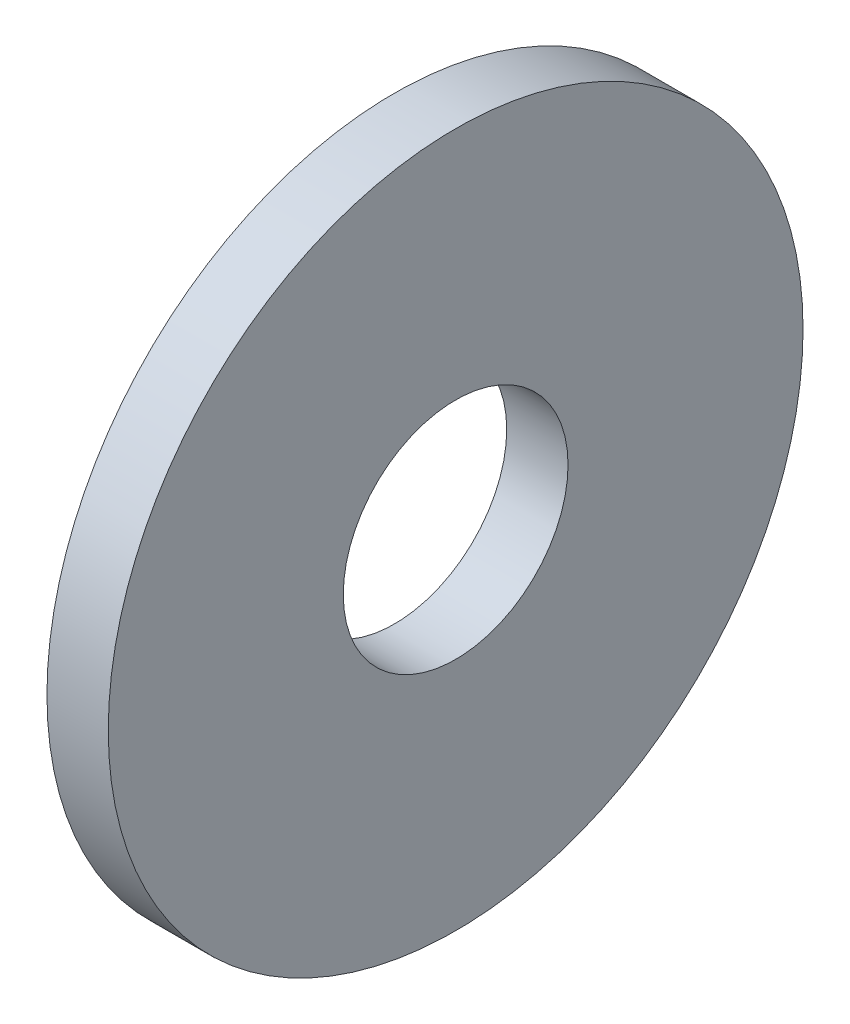
ISO-10303-21;
HEADER;
FILE_DESCRIPTION(('STEP AP214'),'2;1');
FILE_NAME('part.step','',(''),(''),'','','');
FILE_SCHEMA(('AUTOMOTIVE_DESIGN { 1 0 10303 214 1 1 1 1 }'));
ENDSEC;
DATA;
#1=APPLICATION_CONTEXT('core data for automotive mechanical design processes');
#2=APPLICATION_PROTOCOL_DEFINITION('international standard','automotive_design',2000,#1);
#3=PRODUCT_CONTEXT('',#1,'mechanical');
#4=PRODUCT('Part','Part','',(#3));
#5=PRODUCT_RELATED_PRODUCT_CATEGORY('part','',(#4));
#6=PRODUCT_DEFINITION_FORMATION('','',#4);
#7=PRODUCT_DEFINITION_CONTEXT('part definition',#1,'design');
#8=PRODUCT_DEFINITION('design','',#6,#7);
#9=PRODUCT_DEFINITION_SHAPE('','',#8);
#10=(LENGTH_UNIT() NAMED_UNIT(*) SI_UNIT(.MILLI.,.METRE.));
#11=(NAMED_UNIT(*) PLANE_ANGLE_UNIT() SI_UNIT($,.RADIAN.));
#12=(NAMED_UNIT(*) SI_UNIT($,.STERADIAN.) SOLID_ANGLE_UNIT());
#13=UNCERTAINTY_MEASURE_WITH_UNIT(LENGTH_MEASURE(1.E-05),#10,'distance_accuracy_value','');
#14=(GEOMETRIC_REPRESENTATION_CONTEXT(3) GLOBAL_UNCERTAINTY_ASSIGNED_CONTEXT((#13)) GLOBAL_UNIT_ASSIGNED_CONTEXT((#10,
#11,#12)) REPRESENTATION_CONTEXT('',''));
#15=CARTESIAN_POINT('',(0.,0.,0.));
#16=DIRECTION('',(0.,0.,1.));
#17=DIRECTION('',(1.,0.,0.));
#18=AXIS2_PLACEMENT_3D('',#15,#16,#17);
#19=CARTESIAN_POINT('',(-34.9249999999999,0.,0.));
#20=DIRECTION('',(-1.,0.,0.));
#21=DIRECTION('',(0.,0.,1.));
#22=AXIS2_PLACEMENT_3D('',#19,#20,#21);
#23=CYLINDRICAL_SURFACE('',#22,5.5);
#24=CARTESIAN_POINT('',(0.,0.,0.));
#25=DIRECTION('',(-1.,0.,0.));
#26=DIRECTION('',(0.,0.,1.));
#27=AXIS2_PLACEMENT_3D('',#24,#25,#26);
#28=CIRCLE('',#27,5.5);
#29=CARTESIAN_POINT('',(0.,0.,5.5));
#30=VERTEX_POINT('',#29);
#31=EDGE_CURVE('E10',#30,#30,#28,.T.);
#32=ORIENTED_EDGE('',*,*,#31,.F.);
#33=EDGE_LOOP('',(#32));
#34=FACE_BOUND('',#33,.T.);
#35=CARTESIAN_POINT('',(-3.,0.,0.));
#36=DIRECTION('',(-1.,0.,0.));
#37=DIRECTION('',(0.,0.,1.));
#38=AXIS2_PLACEMENT_3D('',#35,#36,#37);
#39=CIRCLE('',#38,5.5);
#40=CARTESIAN_POINT('',(-3.,0.,5.5));
#41=VERTEX_POINT('',#40);
#42=EDGE_CURVE('E46',#41,#41,#39,.T.);
#43=ORIENTED_EDGE('',*,*,#42,.T.);
#44=EDGE_LOOP('',(#43));
#45=FACE_BOUND('',#44,.T.);
#46=ADVANCED_FACE('F32',(#34,#45),#23,.F.);
#47=CARTESIAN_POINT('',(0.,5.5,0.));
#48=DIRECTION('',(-1.,0.,0.));
#49=DIRECTION('',(0.,0.,1.));
#50=AXIS2_PLACEMENT_3D('',#47,#48,#49);
#51=PLANE('',#50);
#52=CARTESIAN_POINT('',(0.,0.,0.));
#53=DIRECTION('',(-1.,0.,0.));
#54=DIRECTION('',(0.,0.,1.));
#55=AXIS2_PLACEMENT_3D('',#52,#53,#54);
#56=CIRCLE('',#55,17.);
#57=CARTESIAN_POINT('',(0.,0.,17.));
#58=VERTEX_POINT('',#57);
#59=EDGE_CURVE('E38',#58,#58,#56,.T.);
#60=ORIENTED_EDGE('',*,*,#59,.F.);
#61=EDGE_LOOP('',(#60));
#62=FACE_BOUND('',#61,.T.);
#63=ORIENTED_EDGE('',*,*,#31,.T.);
#64=EDGE_LOOP('',(#63));
#65=FACE_BOUND('',#64,.T.);
#66=ADVANCED_FACE('F61',(#62,#65),#51,.F.);
#67=CARTESIAN_POINT('',(-34.9249999999999,0.,0.));
#68=DIRECTION('',(-1.,0.,0.));
#69=DIRECTION('',(0.,0.,1.));
#70=AXIS2_PLACEMENT_3D('',#67,#68,#69);
#71=CYLINDRICAL_SURFACE('',#70,17.);
#72=CARTESIAN_POINT('',(-3.,0.,0.));
#73=DIRECTION('',(-1.,0.,0.));
#74=DIRECTION('',(0.,0.,1.));
#75=AXIS2_PLACEMENT_3D('',#72,#73,#74);
#76=CIRCLE('',#75,17.);
#77=CARTESIAN_POINT('',(-3.,0.,17.));
#78=VERTEX_POINT('',#77);
#79=EDGE_CURVE('E42',#78,#78,#76,.T.);
#80=ORIENTED_EDGE('',*,*,#79,.F.);
#81=EDGE_LOOP('',(#80));
#82=FACE_BOUND('',#81,.T.);
#83=ORIENTED_EDGE('',*,*,#59,.T.);
#84=EDGE_LOOP('',(#83));
#85=FACE_BOUND('',#84,.T.);
#86=ADVANCED_FACE('F56',(#82,#85),#71,.T.);
#87=CARTESIAN_POINT('',(-3.,17.,0.));
#88=DIRECTION('',(1.,0.,0.));
#89=DIRECTION('',(0.,0.,-1.));
#90=AXIS2_PLACEMENT_3D('',#87,#88,#89);
#91=PLANE('',#90);
#92=ORIENTED_EDGE('',*,*,#42,.F.);
#93=EDGE_LOOP('',(#92));
#94=FACE_BOUND('',#93,.T.);
#95=ORIENTED_EDGE('',*,*,#79,.T.);
#96=EDGE_LOOP('',(#95));
#97=FACE_BOUND('',#96,.T.);
#98=ADVANCED_FACE('F53',(#94,#97),#91,.F.);
#99=CLOSED_SHELL('',(#46,#66,#86,#98));
#100=MANIFOLD_SOLID_BREP('B2',#99);
#101=ADVANCED_BREP_SHAPE_REPRESENTATION('',(#18,#100),#14);
#102=SHAPE_DEFINITION_REPRESENTATION(#9,#101);
ENDSEC;
END-ISO-10303-21;
